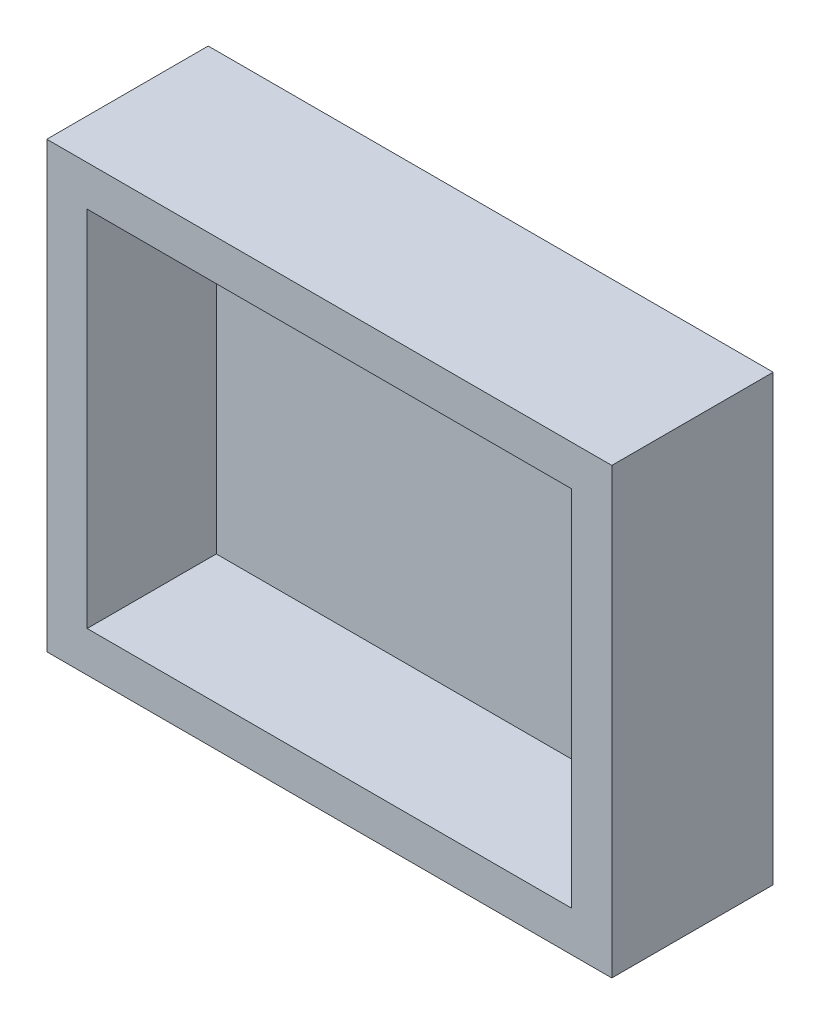
ISO-10303-21;
HEADER;
FILE_DESCRIPTION(('STEP AP214'),'2;1');
FILE_NAME('part.step','',(''),(''),'','','');
FILE_SCHEMA(('AUTOMOTIVE_DESIGN { 1 0 10303 214 1 1 1 1 }'));
ENDSEC;
DATA;
#1=APPLICATION_CONTEXT('core data for automotive mechanical design processes');
#2=APPLICATION_PROTOCOL_DEFINITION('international standard','automotive_design',2000,#1);
#3=PRODUCT_CONTEXT('',#1,'mechanical');
#4=PRODUCT('Part','Part','',(#3));
#5=PRODUCT_RELATED_PRODUCT_CATEGORY('part','',(#4));
#6=PRODUCT_DEFINITION_FORMATION('','',#4);
#7=PRODUCT_DEFINITION_CONTEXT('part definition',#1,'design');
#8=PRODUCT_DEFINITION('design','',#6,#7);
#9=PRODUCT_DEFINITION_SHAPE('','',#8);
#10=(LENGTH_UNIT() NAMED_UNIT(*) SI_UNIT(.MILLI.,.METRE.));
#11=(NAMED_UNIT(*) PLANE_ANGLE_UNIT() SI_UNIT($,.RADIAN.));
#12=(NAMED_UNIT(*) SI_UNIT($,.STERADIAN.) SOLID_ANGLE_UNIT());
#13=UNCERTAINTY_MEASURE_WITH_UNIT(LENGTH_MEASURE(1.E-05),#10,'distance_accuracy_value','');
#14=(GEOMETRIC_REPRESENTATION_CONTEXT(3) GLOBAL_UNCERTAINTY_ASSIGNED_CONTEXT((#13)) GLOBAL_UNIT_ASSIGNED_CONTEXT((#10,
#11,#12)) REPRESENTATION_CONTEXT('',''));
#15=CARTESIAN_POINT('',(0.,0.,0.));
#16=DIRECTION('',(0.,0.,1.));
#17=DIRECTION('',(1.,0.,0.));
#18=AXIS2_PLACEMENT_3D('',#15,#16,#17);
#19=CARTESIAN_POINT('',(-37.298895247321,6.12803738317757,20.));
#20=DIRECTION('',(1.,0.,0.));
#21=DIRECTION('',(0.,1.,0.));
#22=AXIS2_PLACEMENT_3D('',#19,#20,#21);
#23=PLANE('',#22);
#24=DIRECTION('',(0.,0.,-1.));
#25=VECTOR('',#24,1.);
#26=CARTESIAN_POINT('',(-37.298895247321,-38.8719626168224,20.));
#27=LINE('',#26,#25);
#28=CARTESIAN_POINT('',(-37.298895247321,-38.8719626168224,20.));
#29=VERTEX_POINT('',#28);
#30=CARTESIAN_POINT('',(-37.298895247321,-38.8719626168224,4.));
#31=VERTEX_POINT('',#30);
#32=EDGE_CURVE('E118',#29,#31,#27,.T.);
#33=ORIENTED_EDGE('',*,*,#32,.T.);
#34=DIRECTION('',(0.,-1.,0.));
#35=VECTOR('',#34,1.);
#36=CARTESIAN_POINT('',(-37.298895247321,-38.8719626168224,4.));
#37=LINE('',#36,#35);
#38=CARTESIAN_POINT('',(-37.298895247321,6.12803738317757,4.));
#39=VERTEX_POINT('',#38);
#40=EDGE_CURVE('E103',#39,#31,#37,.T.);
#41=ORIENTED_EDGE('',*,*,#40,.F.);
#42=DIRECTION('',(0.,0.,-1.));
#43=VECTOR('',#42,1.);
#44=CARTESIAN_POINT('',(-37.298895247321,6.12803738317757,20.));
#45=LINE('',#44,#43);
#46=CARTESIAN_POINT('',(-37.298895247321,6.12803738317757,20.));
#47=VERTEX_POINT('',#46);
#48=EDGE_CURVE('E226',#47,#39,#45,.T.);
#49=ORIENTED_EDGE('',*,*,#48,.F.);
#50=DIRECTION('',(0.,-1.,0.));
#51=VECTOR('',#50,1.);
#52=CARTESIAN_POINT('',(-37.298895247321,6.12803738317757,20.));
#53=LINE('',#52,#51);
#54=EDGE_CURVE('E125',#47,#29,#53,.T.);
#55=ORIENTED_EDGE('',*,*,#54,.T.);
#56=EDGE_LOOP('',(#33,#41,#49,#55));
#57=FACE_BOUND('',#56,.T.);
#58=ADVANCED_FACE('F39',(#57),#23,.T.);
#59=CARTESIAN_POINT('',(-37.298895247321,-38.8719626168224,20.));
#60=DIRECTION('',(0.,1.,0.));
#61=DIRECTION('',(0.,0.,1.));
#62=AXIS2_PLACEMENT_3D('',#59,#60,#61);
#63=PLANE('',#62);
#64=DIRECTION('',(0.,0.,-1.));
#65=VECTOR('',#64,1.);
#66=CARTESIAN_POINT('',(22.701104752679,-38.8719626168224,20.));
#67=LINE('',#66,#65);
#68=CARTESIAN_POINT('',(22.701104752679,-38.8719626168224,20.));
#69=VERTEX_POINT('',#68);
#70=CARTESIAN_POINT('',(22.701104752679,-38.8719626168224,4.));
#71=VERTEX_POINT('',#70);
#72=EDGE_CURVE('E121',#69,#71,#67,.T.);
#73=ORIENTED_EDGE('',*,*,#72,.T.);
#74=DIRECTION('',(1.,0.,0.));
#75=VECTOR('',#74,1.);
#76=CARTESIAN_POINT('',(-37.298895247321,-38.8719626168224,4.));
#77=LINE('',#76,#75);
#78=EDGE_CURVE('E106',#31,#71,#77,.T.);
#79=ORIENTED_EDGE('',*,*,#78,.F.);
#80=ORIENTED_EDGE('',*,*,#32,.F.);
#81=DIRECTION('',(1.,0.,0.));
#82=VECTOR('',#81,1.);
#83=CARTESIAN_POINT('',(-37.298895247321,-38.8719626168224,20.));
#84=LINE('',#83,#82);
#85=EDGE_CURVE('E235',#29,#69,#84,.T.);
#86=ORIENTED_EDGE('',*,*,#85,.T.);
#87=EDGE_LOOP('',(#73,#79,#80,#86));
#88=FACE_BOUND('',#87,.T.);
#89=ADVANCED_FACE('F117',(#88),#63,.T.);
#90=CARTESIAN_POINT('',(22.701104752679,6.12803738317757,20.));
#91=DIRECTION('',(-1.,0.,0.));
#92=DIRECTION('',(0.,0.,1.));
#93=AXIS2_PLACEMENT_3D('',#90,#91,#92);
#94=PLANE('',#93);
#95=DIRECTION('',(0.,0.,-1.));
#96=VECTOR('',#95,1.);
#97=CARTESIAN_POINT('',(22.701104752679,6.12803738317757,20.));
#98=LINE('',#97,#96);
#99=CARTESIAN_POINT('',(22.701104752679,6.12803738317757,20.));
#100=VERTEX_POINT('',#99);
#101=CARTESIAN_POINT('',(22.701104752679,6.12803738317757,4.));
#102=VERTEX_POINT('',#101);
#103=EDGE_CURVE('E62',#100,#102,#98,.T.);
#104=ORIENTED_EDGE('',*,*,#103,.T.);
#105=DIRECTION('',(0.,1.,0.));
#106=VECTOR('',#105,1.);
#107=CARTESIAN_POINT('',(22.701104752679,-38.8719626168224,4.));
#108=LINE('',#107,#106);
#109=EDGE_CURVE('E55',#71,#102,#108,.T.);
#110=ORIENTED_EDGE('',*,*,#109,.F.);
#111=ORIENTED_EDGE('',*,*,#72,.F.);
#112=DIRECTION('',(0.,1.,0.));
#113=VECTOR('',#112,1.);
#114=CARTESIAN_POINT('',(22.701104752679,6.12803738317757,20.));
#115=LINE('',#114,#113);
#116=EDGE_CURVE('E223',#69,#100,#115,.T.);
#117=ORIENTED_EDGE('',*,*,#116,.T.);
#118=EDGE_LOOP('',(#104,#110,#111,#117));
#119=FACE_BOUND('',#118,.T.);
#120=ADVANCED_FACE('F200',(#119),#94,.T.);
#121=CARTESIAN_POINT('',(-37.298895247321,6.12803738317757,20.));
#122=DIRECTION('',(0.,-1.,0.));
#123=DIRECTION('',(0.,0.,-1.));
#124=AXIS2_PLACEMENT_3D('',#121,#122,#123);
#125=PLANE('',#124);
#126=ORIENTED_EDGE('',*,*,#48,.T.);
#127=DIRECTION('',(-1.,0.,0.));
#128=VECTOR('',#127,1.);
#129=CARTESIAN_POINT('',(-37.298895247321,6.12803738317757,4.));
#130=LINE('',#129,#128);
#131=EDGE_CURVE('E107',#102,#39,#130,.T.);
#132=ORIENTED_EDGE('',*,*,#131,.F.);
#133=ORIENTED_EDGE('',*,*,#103,.F.);
#134=DIRECTION('',(-1.,0.,0.));
#135=VECTOR('',#134,1.);
#136=CARTESIAN_POINT('',(-37.298895247321,6.12803738317757,20.));
#137=LINE('',#136,#135);
#138=EDGE_CURVE('E228',#100,#47,#137,.T.);
#139=ORIENTED_EDGE('',*,*,#138,.T.);
#140=EDGE_LOOP('',(#126,#132,#133,#139));
#141=FACE_BOUND('',#140,.T.);
#142=ADVANCED_FACE('F206',(#141),#125,.T.);
#143=CARTESIAN_POINT('',(0.,0.,20.));
#144=DIRECTION('',(0.,0.,1.));
#145=DIRECTION('',(1.,0.,0.));
#146=AXIS2_PLACEMENT_3D('',#143,#144,#145);
#147=PLANE('',#146);
#148=DIRECTION('',(0.,-1.,0.));
#149=VECTOR('',#148,1.);
#150=CARTESIAN_POINT('',(-42.298895247321,11.1280373831776,20.));
#151=LINE('',#150,#149);
#152=CARTESIAN_POINT('',(-42.298895247321,11.1280373831776,20.));
#153=VERTEX_POINT('',#152);
#154=CARTESIAN_POINT('',(-42.298895247321,-43.8719626168224,20.));
#155=VERTEX_POINT('',#154);
#156=EDGE_CURVE('E137',#153,#155,#151,.T.);
#157=ORIENTED_EDGE('',*,*,#156,.T.);
#158=DIRECTION('',(1.,0.,0.));
#159=VECTOR('',#158,1.);
#160=CARTESIAN_POINT('',(-42.298895247321,-43.8719626168224,20.));
#161=LINE('',#160,#159);
#162=CARTESIAN_POINT('',(27.701104752679,-43.8719626168224,20.));
#163=VERTEX_POINT('',#162);
#164=EDGE_CURVE('E141',#155,#163,#161,.T.);
#165=ORIENTED_EDGE('',*,*,#164,.T.);
#166=DIRECTION('',(0.,1.,0.));
#167=VECTOR('',#166,1.);
#168=CARTESIAN_POINT('',(27.701104752679,11.1280373831776,20.));
#169=LINE('',#168,#167);
#170=CARTESIAN_POINT('',(27.701104752679,11.1280373831776,20.));
#171=VERTEX_POINT('',#170);
#172=EDGE_CURVE('E145',#163,#171,#169,.T.);
#173=ORIENTED_EDGE('',*,*,#172,.T.);
#174=DIRECTION('',(-1.,0.,0.));
#175=VECTOR('',#174,1.);
#176=CARTESIAN_POINT('',(-42.298895247321,11.1280373831776,20.));
#177=LINE('',#176,#175);
#178=EDGE_CURVE('E148',#171,#153,#177,.T.);
#179=ORIENTED_EDGE('',*,*,#178,.T.);
#180=EDGE_LOOP('',(#157,#165,#173,#179));
#181=FACE_BOUND('',#180,.T.);
#182=ORIENTED_EDGE('',*,*,#85,.F.);
#183=ORIENTED_EDGE('',*,*,#54,.F.);
#184=ORIENTED_EDGE('',*,*,#138,.F.);
#185=ORIENTED_EDGE('',*,*,#116,.F.);
#186=EDGE_LOOP('',(#182,#183,#184,#185));
#187=FACE_BOUND('',#186,.T.);
#188=ADVANCED_FACE('F186',(#181,#187),#147,.T.);
#189=CARTESIAN_POINT('',(0.,0.,0.));
#190=DIRECTION('',(0.,0.,1.));
#191=DIRECTION('',(1.,0.,0.));
#192=AXIS2_PLACEMENT_3D('',#189,#190,#191);
#193=PLANE('',#192);
#194=DIRECTION('',(0.,-1.,0.));
#195=VECTOR('',#194,1.);
#196=CARTESIAN_POINT('',(-42.298895247321,11.1280373831776,0.));
#197=LINE('',#196,#195);
#198=CARTESIAN_POINT('',(-42.298895247321,11.1280373831776,0.));
#199=VERTEX_POINT('',#198);
#200=CARTESIAN_POINT('',(-42.298895247321,-43.8719626168224,0.));
#201=VERTEX_POINT('',#200);
#202=EDGE_CURVE('E127',#199,#201,#197,.T.);
#203=ORIENTED_EDGE('',*,*,#202,.F.);
#204=DIRECTION('',(-1.,0.,0.));
#205=VECTOR('',#204,1.);
#206=CARTESIAN_POINT('',(-42.298895247321,11.1280373831776,0.));
#207=LINE('',#206,#205);
#208=CARTESIAN_POINT('',(27.701104752679,11.1280373831776,0.));
#209=VERTEX_POINT('',#208);
#210=EDGE_CURVE('E142',#209,#199,#207,.T.);
#211=ORIENTED_EDGE('',*,*,#210,.F.);
#212=DIRECTION('',(0.,1.,0.));
#213=VECTOR('',#212,1.);
#214=CARTESIAN_POINT('',(27.701104752679,11.1280373831776,0.));
#215=LINE('',#214,#213);
#216=CARTESIAN_POINT('',(27.701104752679,-43.8719626168224,0.));
#217=VERTEX_POINT('',#216);
#218=EDGE_CURVE('E154',#217,#209,#215,.T.);
#219=ORIENTED_EDGE('',*,*,#218,.F.);
#220=DIRECTION('',(1.,0.,0.));
#221=VECTOR('',#220,1.);
#222=CARTESIAN_POINT('',(-42.298895247321,-43.8719626168224,0.));
#223=LINE('',#222,#221);
#224=EDGE_CURVE('E132',#201,#217,#223,.T.);
#225=ORIENTED_EDGE('',*,*,#224,.F.);
#226=EDGE_LOOP('',(#203,#211,#219,#225));
#227=FACE_BOUND('',#226,.T.);
#228=ADVANCED_FACE('F177',(#227),#193,.F.);
#229=CARTESIAN_POINT('',(-42.298895247321,11.1280373831776,20.));
#230=DIRECTION('',(1.,0.,0.));
#231=DIRECTION('',(0.,1.,0.));
#232=AXIS2_PLACEMENT_3D('',#229,#230,#231);
#233=PLANE('',#232);
#234=ORIENTED_EDGE('',*,*,#202,.T.);
#235=DIRECTION('',(0.,0.,-1.));
#236=VECTOR('',#235,1.);
#237=CARTESIAN_POINT('',(-42.298895247321,-43.8719626168224,20.));
#238=LINE('',#237,#236);
#239=EDGE_CURVE('E11',#155,#201,#238,.T.);
#240=ORIENTED_EDGE('',*,*,#239,.F.);
#241=ORIENTED_EDGE('',*,*,#156,.F.);
#242=DIRECTION('',(0.,0.,-1.));
#243=VECTOR('',#242,1.);
#244=CARTESIAN_POINT('',(-42.298895247321,11.1280373831776,20.));
#245=LINE('',#244,#243);
#246=EDGE_CURVE('E150',#153,#199,#245,.T.);
#247=ORIENTED_EDGE('',*,*,#246,.T.);
#248=EDGE_LOOP('',(#234,#240,#241,#247));
#249=FACE_BOUND('',#248,.T.);
#250=ADVANCED_FACE('F41',(#249),#233,.F.);
#251=CARTESIAN_POINT('',(-42.298895247321,-43.8719626168224,20.));
#252=DIRECTION('',(0.,1.,0.));
#253=DIRECTION('',(0.,0.,1.));
#254=AXIS2_PLACEMENT_3D('',#251,#252,#253);
#255=PLANE('',#254);
#256=ORIENTED_EDGE('',*,*,#224,.T.);
#257=DIRECTION('',(0.,0.,-1.));
#258=VECTOR('',#257,1.);
#259=CARTESIAN_POINT('',(27.701104752679,-43.8719626168224,20.));
#260=LINE('',#259,#258);
#261=EDGE_CURVE('E48',#163,#217,#260,.T.);
#262=ORIENTED_EDGE('',*,*,#261,.F.);
#263=ORIENTED_EDGE('',*,*,#164,.F.);
#264=ORIENTED_EDGE('',*,*,#239,.T.);
#265=EDGE_LOOP('',(#256,#262,#263,#264));
#266=FACE_BOUND('',#265,.T.);
#267=ADVANCED_FACE('F188',(#266),#255,.F.);
#268=CARTESIAN_POINT('',(27.701104752679,11.1280373831776,20.));
#269=DIRECTION('',(-1.,0.,0.));
#270=DIRECTION('',(0.,-1.,0.));
#271=AXIS2_PLACEMENT_3D('',#268,#269,#270);
#272=PLANE('',#271);
#273=ORIENTED_EDGE('',*,*,#218,.T.);
#274=DIRECTION('',(0.,0.,-1.));
#275=VECTOR('',#274,1.);
#276=CARTESIAN_POINT('',(27.701104752679,11.1280373831776,20.));
#277=LINE('',#276,#275);
#278=EDGE_CURVE('E162',#171,#209,#277,.T.);
#279=ORIENTED_EDGE('',*,*,#278,.F.);
#280=ORIENTED_EDGE('',*,*,#172,.F.);
#281=ORIENTED_EDGE('',*,*,#261,.T.);
#282=EDGE_LOOP('',(#273,#279,#280,#281));
#283=FACE_BOUND('',#282,.T.);
#284=ADVANCED_FACE('F171',(#283),#272,.F.);
#285=CARTESIAN_POINT('',(-42.298895247321,11.1280373831776,20.));
#286=DIRECTION('',(0.,-1.,0.));
#287=DIRECTION('',(0.,0.,-1.));
#288=AXIS2_PLACEMENT_3D('',#285,#286,#287);
#289=PLANE('',#288);
#290=ORIENTED_EDGE('',*,*,#210,.T.);
#291=ORIENTED_EDGE('',*,*,#246,.F.);
#292=ORIENTED_EDGE('',*,*,#178,.F.);
#293=ORIENTED_EDGE('',*,*,#278,.T.);
#294=EDGE_LOOP('',(#290,#291,#292,#293));
#295=FACE_BOUND('',#294,.T.);
#296=ADVANCED_FACE('F180',(#295),#289,.F.);
#297=CARTESIAN_POINT('',(0.,0.,4.));
#298=DIRECTION('',(0.,0.,-1.));
#299=DIRECTION('',(-1.,0.,0.));
#300=AXIS2_PLACEMENT_3D('',#297,#298,#299);
#301=PLANE('',#300);
#302=ORIENTED_EDGE('',*,*,#40,.T.);
#303=ORIENTED_EDGE('',*,*,#78,.T.);
#304=ORIENTED_EDGE('',*,*,#109,.T.);
#305=ORIENTED_EDGE('',*,*,#131,.T.);
#306=EDGE_LOOP('',(#302,#303,#304,#305));
#307=FACE_BOUND('',#306,.T.);
#308=ADVANCED_FACE('F105',(#307),#301,.F.);
#309=CLOSED_SHELL('',(#58,#89,#120,#142,#188,#228,#250,#267,#284,#296,#308));
#310=MANIFOLD_SOLID_BREP('B2',#309);
#311=ADVANCED_BREP_SHAPE_REPRESENTATION('',(#18,#310),#14);
#312=SHAPE_DEFINITION_REPRESENTATION(#9,#311);
ENDSEC;
END-ISO-10303-21;
